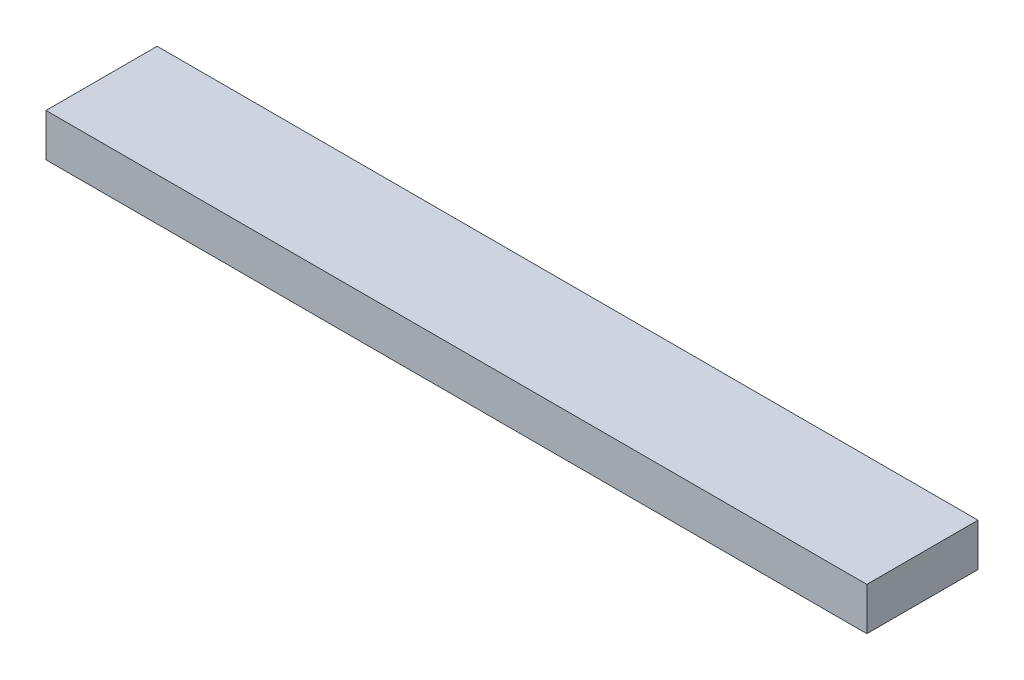
ISO-10303-21;
HEADER;
FILE_DESCRIPTION(('STEP AP214'),'2;1');
FILE_NAME('part.step','',(''),(''),'','','');
FILE_SCHEMA(('AUTOMOTIVE_DESIGN { 1 0 10303 214 1 1 1 1 }'));
ENDSEC;
DATA;
#1=APPLICATION_CONTEXT('core data for automotive mechanical design processes');
#2=APPLICATION_PROTOCOL_DEFINITION('international standard','automotive_design',2000,#1);
#3=PRODUCT_CONTEXT('',#1,'mechanical');
#4=PRODUCT('Part','Part','',(#3));
#5=PRODUCT_RELATED_PRODUCT_CATEGORY('part','',(#4));
#6=PRODUCT_DEFINITION_FORMATION('','',#4);
#7=PRODUCT_DEFINITION_CONTEXT('part definition',#1,'design');
#8=PRODUCT_DEFINITION('design','',#6,#7);
#9=PRODUCT_DEFINITION_SHAPE('','',#8);
#10=(LENGTH_UNIT() NAMED_UNIT(*) SI_UNIT(.MILLI.,.METRE.));
#11=(NAMED_UNIT(*) PLANE_ANGLE_UNIT() SI_UNIT($,.RADIAN.));
#12=(NAMED_UNIT(*) SI_UNIT($,.STERADIAN.) SOLID_ANGLE_UNIT());
#13=UNCERTAINTY_MEASURE_WITH_UNIT(LENGTH_MEASURE(1.E-05),#10,'distance_accuracy_value','');
#14=(GEOMETRIC_REPRESENTATION_CONTEXT(3) GLOBAL_UNCERTAINTY_ASSIGNED_CONTEXT((#13)) GLOBAL_UNIT_ASSIGNED_CONTEXT((#10,
#11,#12)) REPRESENTATION_CONTEXT('',''));
#15=CARTESIAN_POINT('',(0.,0.,0.));
#16=DIRECTION('',(0.,0.,1.));
#17=DIRECTION('',(1.,0.,0.));
#18=AXIS2_PLACEMENT_3D('',#15,#16,#17);
#19=CARTESIAN_POINT('',(0.,3.175,0.));
#20=DIRECTION('',(1.,0.,0.));
#21=DIRECTION('',(0.,0.,-1.));
#22=AXIS2_PLACEMENT_3D('',#19,#20,#21);
#23=PLANE('',#22);
#24=DIRECTION('',(0.,0.,1.));
#25=VECTOR('',#24,1.);
#26=CARTESIAN_POINT('',(0.,0.,0.));
#27=LINE('',#26,#25);
#28=CARTESIAN_POINT('',(0.,0.,-8.255));
#29=VERTEX_POINT('',#28);
#30=CARTESIAN_POINT('',(0.,0.,0.));
#31=VERTEX_POINT('',#30);
#32=EDGE_CURVE('E96',#29,#31,#27,.T.);
#33=ORIENTED_EDGE('',*,*,#32,.T.);
#34=DIRECTION('',(0.,-1.,0.));
#35=VECTOR('',#34,1.);
#36=CARTESIAN_POINT('',(0.,3.175,0.));
#37=LINE('',#36,#35);
#38=CARTESIAN_POINT('',(0.,3.175,0.));
#39=VERTEX_POINT('',#38);
#40=EDGE_CURVE('E11',#39,#31,#37,.T.);
#41=ORIENTED_EDGE('',*,*,#40,.F.);
#42=DIRECTION('',(0.,0.,1.));
#43=VECTOR('',#42,1.);
#44=CARTESIAN_POINT('',(0.,3.175,0.));
#45=LINE('',#44,#43);
#46=CARTESIAN_POINT('',(0.,3.175,-8.255));
#47=VERTEX_POINT('',#46);
#48=EDGE_CURVE('E84',#47,#39,#45,.T.);
#49=ORIENTED_EDGE('',*,*,#48,.F.);
#50=DIRECTION('',(0.,-1.,0.));
#51=VECTOR('',#50,1.);
#52=CARTESIAN_POINT('',(0.,3.175,-8.255));
#53=LINE('',#52,#51);
#54=EDGE_CURVE('E92',#47,#29,#53,.T.);
#55=ORIENTED_EDGE('',*,*,#54,.T.);
#56=EDGE_LOOP('',(#33,#41,#49,#55));
#57=FACE_BOUND('',#56,.T.);
#58=ADVANCED_FACE('F33',(#57),#23,.F.);
#59=CARTESIAN_POINT('',(0.,3.175,0.));
#60=DIRECTION('',(0.,0.,-1.));
#61=DIRECTION('',(-1.,0.,0.));
#62=AXIS2_PLACEMENT_3D('',#59,#60,#61);
#63=PLANE('',#62);
#64=DIRECTION('',(1.,0.,0.));
#65=VECTOR('',#64,1.);
#66=CARTESIAN_POINT('',(0.,0.,0.));
#67=LINE('',#66,#65);
#68=CARTESIAN_POINT('',(60.96,0.,0.));
#69=VERTEX_POINT('',#68);
#70=EDGE_CURVE('E88',#31,#69,#67,.T.);
#71=ORIENTED_EDGE('',*,*,#70,.T.);
#72=DIRECTION('',(0.,-1.,0.));
#73=VECTOR('',#72,1.);
#74=CARTESIAN_POINT('',(60.96,3.175,0.));
#75=LINE('',#74,#73);
#76=CARTESIAN_POINT('',(60.96,3.175,0.));
#77=VERTEX_POINT('',#76);
#78=EDGE_CURVE('E41',#77,#69,#75,.T.);
#79=ORIENTED_EDGE('',*,*,#78,.F.);
#80=DIRECTION('',(1.,0.,0.));
#81=VECTOR('',#80,1.);
#82=CARTESIAN_POINT('',(0.,3.175,0.));
#83=LINE('',#82,#81);
#84=EDGE_CURVE('E79',#39,#77,#83,.T.);
#85=ORIENTED_EDGE('',*,*,#84,.F.);
#86=ORIENTED_EDGE('',*,*,#40,.T.);
#87=EDGE_LOOP('',(#71,#79,#85,#86));
#88=FACE_BOUND('',#87,.T.);
#89=ADVANCED_FACE('F87',(#88),#63,.F.);
#90=CARTESIAN_POINT('',(60.96,3.175,0.));
#91=DIRECTION('',(-1.,0.,0.));
#92=DIRECTION('',(0.,0.,1.));
#93=AXIS2_PLACEMENT_3D('',#90,#91,#92);
#94=PLANE('',#93);
#95=DIRECTION('',(0.,0.,-1.));
#96=VECTOR('',#95,1.);
#97=CARTESIAN_POINT('',(60.96,0.,0.));
#98=LINE('',#97,#96);
#99=CARTESIAN_POINT('',(60.96,0.,-8.255));
#100=VERTEX_POINT('',#99);
#101=EDGE_CURVE('E66',#69,#100,#98,.T.);
#102=ORIENTED_EDGE('',*,*,#101,.T.);
#103=DIRECTION('',(0.,-1.,0.));
#104=VECTOR('',#103,1.);
#105=CARTESIAN_POINT('',(60.96,3.175,-8.255));
#106=LINE('',#105,#104);
#107=CARTESIAN_POINT('',(60.96,3.175,-8.255));
#108=VERTEX_POINT('',#107);
#109=EDGE_CURVE('E89',#108,#100,#106,.T.);
#110=ORIENTED_EDGE('',*,*,#109,.F.);
#111=DIRECTION('',(0.,0.,-1.));
#112=VECTOR('',#111,1.);
#113=CARTESIAN_POINT('',(60.96,3.175,0.));
#114=LINE('',#113,#112);
#115=EDGE_CURVE('E82',#77,#108,#114,.T.);
#116=ORIENTED_EDGE('',*,*,#115,.F.);
#117=ORIENTED_EDGE('',*,*,#78,.T.);
#118=EDGE_LOOP('',(#102,#110,#116,#117));
#119=FACE_BOUND('',#118,.T.);
#120=ADVANCED_FACE('F90',(#119),#94,.F.);
#121=CARTESIAN_POINT('',(0.,3.175,-8.255));
#122=DIRECTION('',(0.,0.,1.));
#123=DIRECTION('',(1.,0.,0.));
#124=AXIS2_PLACEMENT_3D('',#121,#122,#123);
#125=PLANE('',#124);
#126=DIRECTION('',(-1.,0.,0.));
#127=VECTOR('',#126,1.);
#128=CARTESIAN_POINT('',(0.,0.,-8.255));
#129=LINE('',#128,#127);
#130=EDGE_CURVE('E72',#100,#29,#129,.T.);
#131=ORIENTED_EDGE('',*,*,#130,.T.);
#132=ORIENTED_EDGE('',*,*,#54,.F.);
#133=DIRECTION('',(-1.,0.,0.));
#134=VECTOR('',#133,1.);
#135=CARTESIAN_POINT('',(0.,3.175,-8.255));
#136=LINE('',#135,#134);
#137=EDGE_CURVE('E49',#108,#47,#136,.T.);
#138=ORIENTED_EDGE('',*,*,#137,.F.);
#139=ORIENTED_EDGE('',*,*,#109,.T.);
#140=EDGE_LOOP('',(#131,#132,#138,#139));
#141=FACE_BOUND('',#140,.T.);
#142=ADVANCED_FACE('F103',(#141),#125,.F.);
#143=CARTESIAN_POINT('',(0.,3.175,0.));
#144=DIRECTION('',(0.,-1.,0.));
#145=DIRECTION('',(0.,0.,-1.));
#146=AXIS2_PLACEMENT_3D('',#143,#144,#145);
#147=PLANE('',#146);
#148=ORIENTED_EDGE('',*,*,#48,.T.);
#149=ORIENTED_EDGE('',*,*,#84,.T.);
#150=ORIENTED_EDGE('',*,*,#115,.T.);
#151=ORIENTED_EDGE('',*,*,#137,.T.);
#152=EDGE_LOOP('',(#148,#149,#150,#151));
#153=FACE_BOUND('',#152,.T.);
#154=ADVANCED_FACE('F80',(#153),#147,.F.);
#155=CARTESIAN_POINT('',(0.,0.,0.));
#156=DIRECTION('',(0.,-1.,0.));
#157=DIRECTION('',(0.,0.,-1.));
#158=AXIS2_PLACEMENT_3D('',#155,#156,#157);
#159=PLANE('',#158);
#160=ORIENTED_EDGE('',*,*,#32,.F.);
#161=ORIENTED_EDGE('',*,*,#130,.F.);
#162=ORIENTED_EDGE('',*,*,#101,.F.);
#163=ORIENTED_EDGE('',*,*,#70,.F.);
#164=EDGE_LOOP('',(#160,#161,#162,#163));
#165=FACE_BOUND('',#164,.T.);
#166=ADVANCED_FACE('F106',(#165),#159,.T.);
#167=CLOSED_SHELL('',(#58,#89,#120,#142,#154,#166));
#168=MANIFOLD_SOLID_BREP('B2',#167);
#169=ADVANCED_BREP_SHAPE_REPRESENTATION('',(#18,#168),#14);
#170=SHAPE_DEFINITION_REPRESENTATION(#9,#169);
ENDSEC;
END-ISO-10303-21;
